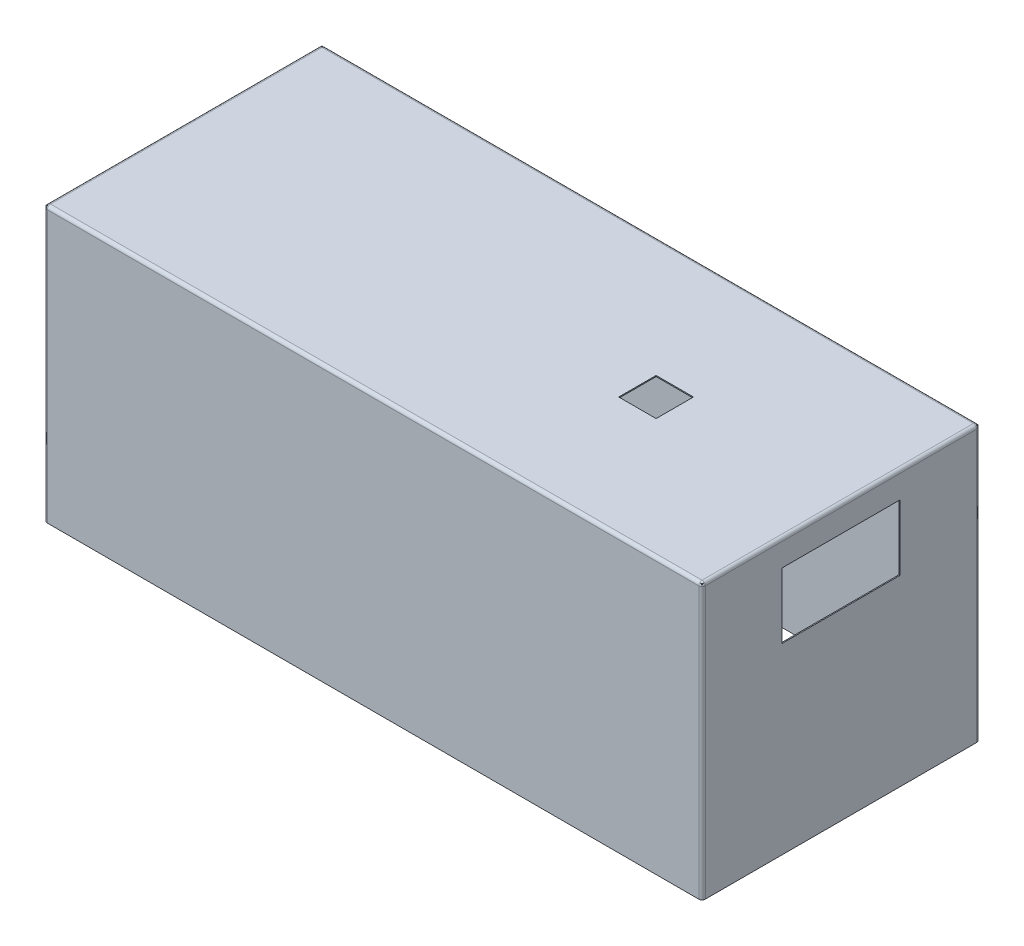
ISO-10303-21;
HEADER;
FILE_DESCRIPTION(('STEP AP214'),'2;1');
FILE_NAME('part.step','',(''),(''),'','','');
FILE_SCHEMA(('AUTOMOTIVE_DESIGN { 1 0 10303 214 1 1 1 1 }'));
ENDSEC;
DATA;
#1=APPLICATION_CONTEXT('core data for automotive mechanical design processes');
#2=APPLICATION_PROTOCOL_DEFINITION('international standard','automotive_design',2000,#1);
#3=PRODUCT_CONTEXT('',#1,'mechanical');
#4=PRODUCT('Part','Part','',(#3));
#5=PRODUCT_RELATED_PRODUCT_CATEGORY('part','',(#4));
#6=PRODUCT_DEFINITION_FORMATION('','',#4);
#7=PRODUCT_DEFINITION_CONTEXT('part definition',#1,'design');
#8=PRODUCT_DEFINITION('design','',#6,#7);
#9=PRODUCT_DEFINITION_SHAPE('','',#8);
#10=(LENGTH_UNIT() NAMED_UNIT(*) SI_UNIT(.MILLI.,.METRE.));
#11=(NAMED_UNIT(*) PLANE_ANGLE_UNIT() SI_UNIT($,.RADIAN.));
#12=(NAMED_UNIT(*) SI_UNIT($,.STERADIAN.) SOLID_ANGLE_UNIT());
#13=UNCERTAINTY_MEASURE_WITH_UNIT(LENGTH_MEASURE(1.E-05),#10,'distance_accuracy_value','');
#14=(GEOMETRIC_REPRESENTATION_CONTEXT(3) GLOBAL_UNCERTAINTY_ASSIGNED_CONTEXT((#13)) GLOBAL_UNIT_ASSIGNED_CONTEXT((#10,
#11,#12)) REPRESENTATION_CONTEXT('',''));
#15=CARTESIAN_POINT('',(0.,0.,0.));
#16=DIRECTION('',(0.,0.,1.));
#17=DIRECTION('',(1.,0.,0.));
#18=AXIS2_PLACEMENT_3D('',#15,#16,#17);
#19=CARTESIAN_POINT('',(501.5125,420.,-210.9125));
#20=DIRECTION('',(-1.,0.,0.));
#21=DIRECTION('',(0.,0.,1.));
#22=AXIS2_PLACEMENT_3D('',#19,#20,#21);
#23=PLANE('',#22);
#24=DIRECTION('',(0.,-1.,0.));
#25=VECTOR('',#24,1.);
#26=CARTESIAN_POINT('',(501.5125,420.,210.9125));
#27=LINE('',#26,#25);
#28=CARTESIAN_POINT('',(501.5125,418.4125,210.9125));
#29=VERTEX_POINT('',#28);
#30=CARTESIAN_POINT('',(501.5125,0.,210.9125));
#31=VERTEX_POINT('',#30);
#32=EDGE_CURVE('E366',#29,#31,#27,.T.);
#33=ORIENTED_EDGE('',*,*,#32,.F.);
#34=DIRECTION('',(0.,0.,-1.));
#35=VECTOR('',#34,1.);
#36=CARTESIAN_POINT('',(501.5125,418.4125,-210.9125));
#37=LINE('',#36,#35);
#38=CARTESIAN_POINT('',(501.5125,418.4125,-210.9125));
#39=VERTEX_POINT('',#38);
#40=EDGE_CURVE('E350',#29,#39,#37,.T.);
#41=ORIENTED_EDGE('',*,*,#40,.T.);
#42=DIRECTION('',(0.,-1.,0.));
#43=VECTOR('',#42,1.);
#44=CARTESIAN_POINT('',(501.5125,420.,-210.9125));
#45=LINE('',#44,#43);
#46=CARTESIAN_POINT('',(501.5125,0.,-210.9125));
#47=VERTEX_POINT('',#46);
#48=EDGE_CURVE('E373',#39,#47,#45,.T.);
#49=ORIENTED_EDGE('',*,*,#48,.T.);
#50=DIRECTION('',(0.,0.,-1.));
#51=VECTOR('',#50,1.);
#52=CARTESIAN_POINT('',(501.5125,0.,-210.9125));
#53=LINE('',#52,#51);
#54=EDGE_CURVE('E353',#31,#47,#53,.T.);
#55=ORIENTED_EDGE('',*,*,#54,.F.);
#56=EDGE_LOOP('',(#33,#41,#49,#55));
#57=FACE_BOUND('',#56,.T.);
#58=DIRECTION('',(0.,-1.,0.));
#59=VECTOR('',#58,1.);
#60=CARTESIAN_POINT('',(501.5125,420.,90.0000000000001));
#61=LINE('',#60,#59);
#62=CARTESIAN_POINT('',(501.5125,380.,90.));
#63=VERTEX_POINT('',#62);
#64=CARTESIAN_POINT('',(501.5125,280.,90.));
#65=VERTEX_POINT('',#64);
#66=EDGE_CURVE('E295',#63,#65,#61,.T.);
#67=ORIENTED_EDGE('',*,*,#66,.T.);
#68=DIRECTION('',(0.,0.,-1.));
#69=VECTOR('',#68,1.);
#70=CARTESIAN_POINT('',(501.5125,280.,-210.9125));
#71=LINE('',#70,#69);
#72=CARTESIAN_POINT('',(501.5125,280.,-90.));
#73=VERTEX_POINT('',#72);
#74=EDGE_CURVE('E298',#65,#73,#71,.T.);
#75=ORIENTED_EDGE('',*,*,#74,.T.);
#76=DIRECTION('',(0.,1.,0.));
#77=VECTOR('',#76,1.);
#78=CARTESIAN_POINT('',(501.5125,420.,-89.9999999999999));
#79=LINE('',#78,#77);
#80=CARTESIAN_POINT('',(501.5125,380.,-90.));
#81=VERTEX_POINT('',#80);
#82=EDGE_CURVE('E279',#73,#81,#79,.T.);
#83=ORIENTED_EDGE('',*,*,#82,.T.);
#84=DIRECTION('',(0.,0.,1.));
#85=VECTOR('',#84,1.);
#86=CARTESIAN_POINT('',(501.5125,380.,-210.9125));
#87=LINE('',#86,#85);
#88=EDGE_CURVE('E292',#81,#63,#87,.T.);
#89=ORIENTED_EDGE('',*,*,#88,.T.);
#90=EDGE_LOOP('',(#67,#75,#83,#89));
#91=FACE_BOUND('',#90,.T.);
#92=ADVANCED_FACE('F33',(#57,#91),#23,.T.);
#93=CARTESIAN_POINT('',(503.1,420.,-212.5));
#94=DIRECTION('',(-1.,0.,0.));
#95=DIRECTION('',(0.,0.,1.));
#96=AXIS2_PLACEMENT_3D('',#93,#94,#95);
#97=PLANE('',#96);
#98=DIRECTION('',(0.,0.,-1.));
#99=VECTOR('',#98,1.);
#100=CARTESIAN_POINT('',(503.1,415.,212.5));
#101=LINE('',#100,#99);
#102=CARTESIAN_POINT('',(503.1,415.,-207.5));
#103=VERTEX_POINT('',#102);
#104=CARTESIAN_POINT('',(503.1,415.,207.5));
#105=VERTEX_POINT('',#104);
#106=EDGE_CURVE('E420',#103,#105,#101,.F.);
#107=ORIENTED_EDGE('',*,*,#106,.T.);
#108=DIRECTION('',(0.,-1.,0.));
#109=VECTOR('',#108,1.);
#110=CARTESIAN_POINT('',(503.1,420.,207.5));
#111=LINE('',#110,#109);
#112=CARTESIAN_POINT('',(503.1,0.,207.5));
#113=VERTEX_POINT('',#112);
#114=EDGE_CURVE('E422',#105,#113,#111,.T.);
#115=ORIENTED_EDGE('',*,*,#114,.T.);
#116=DIRECTION('',(0.,0.,-1.));
#117=VECTOR('',#116,1.);
#118=CARTESIAN_POINT('',(503.1,0.,-212.5));
#119=LINE('',#118,#117);
#120=CARTESIAN_POINT('',(503.1,0.,-207.5));
#121=VERTEX_POINT('',#120);
#122=EDGE_CURVE('E375',#113,#121,#119,.T.);
#123=ORIENTED_EDGE('',*,*,#122,.T.);
#124=DIRECTION('',(0.,-1.,0.));
#125=VECTOR('',#124,1.);
#126=CARTESIAN_POINT('',(503.1,420.,-207.5));
#127=LINE('',#126,#125);
#128=EDGE_CURVE('E418',#121,#103,#127,.F.);
#129=ORIENTED_EDGE('',*,*,#128,.T.);
#130=EDGE_LOOP('',(#107,#115,#123,#129));
#131=FACE_BOUND('',#130,.T.);
#132=DIRECTION('',(0.,0.,1.));
#133=VECTOR('',#132,1.);
#134=CARTESIAN_POINT('',(503.1,280.,90.));
#135=LINE('',#134,#133);
#136=CARTESIAN_POINT('',(503.1,280.,-90.));
#137=VERTEX_POINT('',#136);
#138=CARTESIAN_POINT('',(503.1,280.,90.));
#139=VERTEX_POINT('',#138);
#140=EDGE_CURVE('E273',#137,#139,#135,.T.);
#141=ORIENTED_EDGE('',*,*,#140,.T.);
#142=DIRECTION('',(0.,1.,0.));
#143=VECTOR('',#142,1.);
#144=CARTESIAN_POINT('',(503.1,380.,90.));
#145=LINE('',#144,#143);
#146=CARTESIAN_POINT('',(503.1,380.,90.));
#147=VERTEX_POINT('',#146);
#148=EDGE_CURVE('E269',#139,#147,#145,.T.);
#149=ORIENTED_EDGE('',*,*,#148,.T.);
#150=DIRECTION('',(0.,0.,-1.));
#151=VECTOR('',#150,1.);
#152=CARTESIAN_POINT('',(503.1,380.,90.));
#153=LINE('',#152,#151);
#154=CARTESIAN_POINT('',(503.1,380.,-90.));
#155=VERTEX_POINT('',#154);
#156=EDGE_CURVE('E272',#147,#155,#153,.T.);
#157=ORIENTED_EDGE('',*,*,#156,.T.);
#158=DIRECTION('',(0.,-1.,0.));
#159=VECTOR('',#158,1.);
#160=CARTESIAN_POINT('',(503.1,380.,-90.));
#161=LINE('',#160,#159);
#162=EDGE_CURVE('E276',#155,#137,#161,.T.);
#163=ORIENTED_EDGE('',*,*,#162,.T.);
#164=EDGE_LOOP('',(#141,#149,#157,#163));
#165=FACE_BOUND('',#164,.T.);
#166=ADVANCED_FACE('F490',(#131,#165),#97,.F.);
#167=CARTESIAN_POINT('',(0.,420.,0.));
#168=DIRECTION('',(0.,1.,0.));
#169=DIRECTION('',(0.,0.,1.));
#170=AXIS2_PLACEMENT_3D('',#167,#168,#169);
#171=PLANE('',#170);
#172=DIRECTION('',(0.,0.,1.));
#173=VECTOR('',#172,1.);
#174=CARTESIAN_POINT('',(-498.1,420.,212.5));
#175=LINE('',#174,#173);
#176=CARTESIAN_POINT('',(-498.1,420.,-207.5));
#177=VERTEX_POINT('',#176);
#178=CARTESIAN_POINT('',(-498.1,420.,207.5));
#179=VERTEX_POINT('',#178);
#180=EDGE_CURVE('E394',#177,#179,#175,.T.);
#181=ORIENTED_EDGE('',*,*,#180,.T.);
#182=DIRECTION('',(1.,0.,0.));
#183=VECTOR('',#182,1.);
#184=CARTESIAN_POINT('',(503.1,420.,207.5));
#185=LINE('',#184,#183);
#186=CARTESIAN_POINT('',(498.1,420.,207.5));
#187=VERTEX_POINT('',#186);
#188=EDGE_CURVE('E396',#179,#187,#185,.T.);
#189=ORIENTED_EDGE('',*,*,#188,.T.);
#190=DIRECTION('',(0.,0.,-1.));
#191=VECTOR('',#190,1.);
#192=CARTESIAN_POINT('',(498.1,420.,-212.5));
#193=LINE('',#192,#191);
#194=CARTESIAN_POINT('',(498.1,420.,-207.5));
#195=VERTEX_POINT('',#194);
#196=EDGE_CURVE('E390',#187,#195,#193,.T.);
#197=ORIENTED_EDGE('',*,*,#196,.T.);
#198=DIRECTION('',(-1.,0.,0.));
#199=VECTOR('',#198,1.);
#200=CARTESIAN_POINT('',(-503.1,420.,-207.5));
#201=LINE('',#200,#199);
#202=EDGE_CURVE('E392',#195,#177,#201,.T.);
#203=ORIENTED_EDGE('',*,*,#202,.T.);
#204=EDGE_LOOP('',(#181,#189,#197,#203));
#205=FACE_BOUND('',#204,.T.);
#206=DIRECTION('',(-1.,0.,0.));
#207=VECTOR('',#206,1.);
#208=CARTESIAN_POINT('',(191.825,420.,-28.575));
#209=LINE('',#208,#207);
#210=CARTESIAN_POINT('',(248.975,420.,-28.575));
#211=VERTEX_POINT('',#210);
#212=CARTESIAN_POINT('',(191.825,420.,-28.575));
#213=VERTEX_POINT('',#212);
#214=EDGE_CURVE('E305',#211,#213,#209,.T.);
#215=ORIENTED_EDGE('',*,*,#214,.F.);
#216=DIRECTION('',(0.,0.,-1.));
#217=VECTOR('',#216,1.);
#218=CARTESIAN_POINT('',(248.975,420.,-28.575));
#219=LINE('',#218,#217);
#220=CARTESIAN_POINT('',(248.975,420.,28.575));
#221=VERTEX_POINT('',#220);
#222=EDGE_CURVE('E308',#221,#211,#219,.T.);
#223=ORIENTED_EDGE('',*,*,#222,.F.);
#224=DIRECTION('',(1.,0.,0.));
#225=VECTOR('',#224,1.);
#226=CARTESIAN_POINT('',(191.825,420.,28.575));
#227=LINE('',#226,#225);
#228=CARTESIAN_POINT('',(191.825,420.,28.575));
#229=VERTEX_POINT('',#228);
#230=EDGE_CURVE('E311',#229,#221,#227,.T.);
#231=ORIENTED_EDGE('',*,*,#230,.F.);
#232=DIRECTION('',(0.,0.,1.));
#233=VECTOR('',#232,1.);
#234=CARTESIAN_POINT('',(191.825,420.,-28.575));
#235=LINE('',#234,#233);
#236=EDGE_CURVE('E302',#213,#229,#235,.T.);
#237=ORIENTED_EDGE('',*,*,#236,.F.);
#238=EDGE_LOOP('',(#215,#223,#231,#237));
#239=FACE_BOUND('',#238,.T.);
#240=ADVANCED_FACE('F488',(#205,#239),#171,.T.);
#241=CARTESIAN_POINT('',(0.,418.4125,0.));
#242=DIRECTION('',(0.,1.,0.));
#243=DIRECTION('',(0.,0.,1.));
#244=AXIS2_PLACEMENT_3D('',#241,#242,#243);
#245=PLANE('',#244);
#246=ORIENTED_EDGE('',*,*,#40,.F.);
#247=DIRECTION('',(1.,0.,0.));
#248=VECTOR('',#247,1.);
#249=CARTESIAN_POINT('',(-501.5125,418.4125,210.9125));
#250=LINE('',#249,#248);
#251=CARTESIAN_POINT('',(-501.5125,418.4125,210.9125));
#252=VERTEX_POINT('',#251);
#253=EDGE_CURVE('E387',#252,#29,#250,.T.);
#254=ORIENTED_EDGE('',*,*,#253,.F.);
#255=DIRECTION('',(0.,0.,1.));
#256=VECTOR('',#255,1.);
#257=CARTESIAN_POINT('',(-501.5125,418.4125,-210.9125));
#258=LINE('',#257,#256);
#259=CARTESIAN_POINT('',(-501.5125,418.4125,-210.9125));
#260=VERTEX_POINT('',#259);
#261=EDGE_CURVE('E343',#260,#252,#258,.T.);
#262=ORIENTED_EDGE('',*,*,#261,.F.);
#263=DIRECTION('',(-1.,0.,0.));
#264=VECTOR('',#263,1.);
#265=CARTESIAN_POINT('',(-501.5125,418.4125,-210.9125));
#266=LINE('',#265,#264);
#267=EDGE_CURVE('E346',#39,#260,#266,.T.);
#268=ORIENTED_EDGE('',*,*,#267,.F.);
#269=EDGE_LOOP('',(#246,#254,#262,#268));
#270=FACE_BOUND('',#269,.T.);
#271=DIRECTION('',(0.,0.,1.));
#272=VECTOR('',#271,1.);
#273=CARTESIAN_POINT('',(248.975,418.4125,0.));
#274=LINE('',#273,#272);
#275=CARTESIAN_POINT('',(248.975,418.4125,-28.575));
#276=VERTEX_POINT('',#275);
#277=CARTESIAN_POINT('',(248.975,418.4125,28.575));
#278=VERTEX_POINT('',#277);
#279=EDGE_CURVE('E11',#276,#278,#274,.T.);
#280=ORIENTED_EDGE('',*,*,#279,.F.);
#281=DIRECTION('',(1.,0.,0.));
#282=VECTOR('',#281,1.);
#283=CARTESIAN_POINT('',(0.,418.4125,-28.575));
#284=LINE('',#283,#282);
#285=CARTESIAN_POINT('',(191.825,418.4125,-28.575));
#286=VERTEX_POINT('',#285);
#287=EDGE_CURVE('E41',#286,#276,#284,.T.);
#288=ORIENTED_EDGE('',*,*,#287,.F.);
#289=DIRECTION('',(0.,0.,-1.));
#290=VECTOR('',#289,1.);
#291=CARTESIAN_POINT('',(191.825,418.4125,0.));
#292=LINE('',#291,#290);
#293=CARTESIAN_POINT('',(191.825,418.4125,28.575));
#294=VERTEX_POINT('',#293);
#295=EDGE_CURVE('E467',#294,#286,#292,.T.);
#296=ORIENTED_EDGE('',*,*,#295,.F.);
#297=DIRECTION('',(-1.,0.,0.));
#298=VECTOR('',#297,1.);
#299=CARTESIAN_POINT('',(0.,418.4125,28.575));
#300=LINE('',#299,#298);
#301=EDGE_CURVE('E433',#278,#294,#300,.T.);
#302=ORIENTED_EDGE('',*,*,#301,.F.);
#303=EDGE_LOOP('',(#280,#288,#296,#302));
#304=FACE_BOUND('',#303,.T.);
#305=ADVANCED_FACE('F479',(#270,#304),#245,.F.);
#306=CARTESIAN_POINT('',(-501.5125,420.,-210.9125));
#307=DIRECTION('',(0.,0.,1.));
#308=DIRECTION('',(1.,0.,0.));
#309=AXIS2_PLACEMENT_3D('',#306,#307,#308);
#310=PLANE('',#309);
#311=ORIENTED_EDGE('',*,*,#48,.F.);
#312=ORIENTED_EDGE('',*,*,#267,.T.);
#313=DIRECTION('',(0.,-1.,0.));
#314=VECTOR('',#313,1.);
#315=CARTESIAN_POINT('',(-501.5125,420.,-210.9125));
#316=LINE('',#315,#314);
#317=CARTESIAN_POINT('',(-501.5125,0.,-210.9125));
#318=VERTEX_POINT('',#317);
#319=EDGE_CURVE('E371',#260,#318,#316,.T.);
#320=ORIENTED_EDGE('',*,*,#319,.T.);
#321=DIRECTION('',(-1.,0.,0.));
#322=VECTOR('',#321,1.);
#323=CARTESIAN_POINT('',(-501.5125,0.,-210.9125));
#324=LINE('',#323,#322);
#325=EDGE_CURVE('E356',#47,#318,#324,.T.);
#326=ORIENTED_EDGE('',*,*,#325,.F.);
#327=EDGE_LOOP('',(#311,#312,#320,#326));
#328=FACE_BOUND('',#327,.T.);
#329=ADVANCED_FACE('F497',(#328),#310,.T.);
#330=CARTESIAN_POINT('',(-501.5125,420.,-210.9125));
#331=DIRECTION('',(1.,0.,0.));
#332=DIRECTION('',(0.,0.,-1.));
#333=AXIS2_PLACEMENT_3D('',#330,#331,#332);
#334=PLANE('',#333);
#335=DIRECTION('',(0.,0.,-1.));
#336=VECTOR('',#335,1.);
#337=CARTESIAN_POINT('',(-501.5125,80.0000000000001,-210.9125));
#338=LINE('',#337,#336);
#339=CARTESIAN_POINT('',(-501.5125,80.,89.9999999999999));
#340=VERTEX_POINT('',#339);
#341=CARTESIAN_POINT('',(-501.5125,80.,40.));
#342=VERTEX_POINT('',#341);
#343=EDGE_CURVE('E258',#340,#342,#338,.T.);
#344=ORIENTED_EDGE('',*,*,#343,.F.);
#345=DIRECTION('',(0.,-1.,0.));
#346=VECTOR('',#345,1.);
#347=CARTESIAN_POINT('',(-501.5125,420.,89.9999999999999));
#348=LINE('',#347,#346);
#349=CARTESIAN_POINT('',(-501.5125,180.,89.9999999999999));
#350=VERTEX_POINT('',#349);
#351=EDGE_CURVE('E267',#350,#340,#348,.T.);
#352=ORIENTED_EDGE('',*,*,#351,.F.);
#353=DIRECTION('',(0.,0.,1.));
#354=VECTOR('',#353,1.);
#355=CARTESIAN_POINT('',(-501.5125,180.,-210.9125));
#356=LINE('',#355,#354);
#357=CARTESIAN_POINT('',(-501.5125,180.,-90.0000000000001));
#358=VERTEX_POINT('',#357);
#359=EDGE_CURVE('E265',#358,#350,#356,.T.);
#360=ORIENTED_EDGE('',*,*,#359,.F.);
#361=DIRECTION('',(0.,1.,0.));
#362=VECTOR('',#361,1.);
#363=CARTESIAN_POINT('',(-501.5125,420.,-90.0000000000001));
#364=LINE('',#363,#362);
#365=CARTESIAN_POINT('',(-501.5125,80.0000000000001,-90.0000000000002));
#366=VERTEX_POINT('',#365);
#367=EDGE_CURVE('E263',#366,#358,#364,.T.);
#368=ORIENTED_EDGE('',*,*,#367,.F.);
#369=CARTESIAN_POINT('',(-501.5125,80.,-40.0000000000003));
#370=VERTEX_POINT('',#369);
#371=EDGE_CURVE('E248',#370,#366,#338,.T.);
#372=ORIENTED_EDGE('',*,*,#371,.F.);
#373=DIRECTION('',(0.,-1.,0.));
#374=VECTOR('',#373,1.);
#375=CARTESIAN_POINT('',(-501.5125,0.,-40.));
#376=LINE('',#375,#374);
#377=CARTESIAN_POINT('',(-501.5125,0.,-40.0000000000003));
#378=VERTEX_POINT('',#377);
#379=EDGE_CURVE('E304',#370,#378,#376,.T.);
#380=ORIENTED_EDGE('',*,*,#379,.T.);
#381=DIRECTION('',(0.,0.,1.));
#382=VECTOR('',#381,1.);
#383=CARTESIAN_POINT('',(-501.5125,0.,-210.9125));
#384=LINE('',#383,#382);
#385=EDGE_CURVE('E360',#318,#378,#384,.T.);
#386=ORIENTED_EDGE('',*,*,#385,.F.);
#387=ORIENTED_EDGE('',*,*,#319,.F.);
#388=ORIENTED_EDGE('',*,*,#261,.T.);
#389=DIRECTION('',(0.,-1.,0.));
#390=VECTOR('',#389,1.);
#391=CARTESIAN_POINT('',(-501.5125,420.,210.9125));
#392=LINE('',#391,#390);
#393=CARTESIAN_POINT('',(-501.5125,0.,210.9125));
#394=VERTEX_POINT('',#393);
#395=EDGE_CURVE('E368',#252,#394,#392,.T.);
#396=ORIENTED_EDGE('',*,*,#395,.T.);
#397=CARTESIAN_POINT('',(-501.5125,0.,40.));
#398=VERTEX_POINT('',#397);
#399=EDGE_CURVE('E359',#398,#394,#384,.T.);
#400=ORIENTED_EDGE('',*,*,#399,.F.);
#401=DIRECTION('',(0.,1.,0.));
#402=VECTOR('',#401,1.);
#403=CARTESIAN_POINT('',(-501.5125,0.,40.));
#404=LINE('',#403,#402);
#405=EDGE_CURVE('E333',#398,#342,#404,.T.);
#406=ORIENTED_EDGE('',*,*,#405,.T.);
#407=EDGE_LOOP('',(#344,#352,#360,#368,#372,#380,#386,#387,#388,#396,#400,#406));
#408=FACE_BOUND('',#407,.T.);
#409=ADVANCED_FACE('F513',(#408),#334,.T.);
#410=CARTESIAN_POINT('',(-501.5125,420.,210.9125));
#411=DIRECTION('',(0.,0.,-1.));
#412=DIRECTION('',(-1.,0.,0.));
#413=AXIS2_PLACEMENT_3D('',#410,#411,#412);
#414=PLANE('',#413);
#415=ORIENTED_EDGE('',*,*,#395,.F.);
#416=ORIENTED_EDGE('',*,*,#253,.T.);
#417=ORIENTED_EDGE('',*,*,#32,.T.);
#418=DIRECTION('',(1.,0.,0.));
#419=VECTOR('',#418,1.);
#420=CARTESIAN_POINT('',(-501.5125,0.,210.9125));
#421=LINE('',#420,#419);
#422=EDGE_CURVE('E363',#394,#31,#421,.T.);
#423=ORIENTED_EDGE('',*,*,#422,.F.);
#424=EDGE_LOOP('',(#415,#416,#417,#423));
#425=FACE_BOUND('',#424,.T.);
#426=ADVANCED_FACE('F517',(#425),#414,.T.);
#427=CARTESIAN_POINT('',(0.,0.,0.));
#428=DIRECTION('',(0.,1.,0.));
#429=DIRECTION('',(0.,0.,1.));
#430=AXIS2_PLACEMENT_3D('',#427,#428,#429);
#431=PLANE('',#430);
#432=ORIENTED_EDGE('',*,*,#385,.T.);
#433=DIRECTION('',(-1.,0.,0.));
#434=VECTOR('',#433,1.);
#435=CARTESIAN_POINT('',(503.101,0.,-40.0000000000003));
#436=LINE('',#435,#434);
#437=CARTESIAN_POINT('',(-503.1,0.,-40.));
#438=VERTEX_POINT('',#437);
#439=EDGE_CURVE('E332',#378,#438,#436,.T.);
#440=ORIENTED_EDGE('',*,*,#439,.T.);
#441=DIRECTION('',(0.,0.,1.));
#442=VECTOR('',#441,1.);
#443=CARTESIAN_POINT('',(-503.1,0.,-212.5));
#444=LINE('',#443,#442);
#445=CARTESIAN_POINT('',(-503.1,0.,-207.5));
#446=VERTEX_POINT('',#445);
#447=EDGE_CURVE('E382',#446,#438,#444,.T.);
#448=ORIENTED_EDGE('',*,*,#447,.F.);
#449=CARTESIAN_POINT('',(-498.1,0.,-207.5));
#450=DIRECTION('',(0.,1.,0.));
#451=DIRECTION('',(0.,0.,1.));
#452=AXIS2_PLACEMENT_3D('',#449,#450,#451);
#453=CIRCLE('',#452,5.);
#454=CARTESIAN_POINT('',(-498.1,0.,-212.5));
#455=VERTEX_POINT('',#454);
#456=EDGE_CURVE('E426',#446,#455,#453,.F.);
#457=ORIENTED_EDGE('',*,*,#456,.T.);
#458=DIRECTION('',(-1.,0.,0.));
#459=VECTOR('',#458,1.);
#460=CARTESIAN_POINT('',(-503.1,0.,-212.5));
#461=LINE('',#460,#459);
#462=CARTESIAN_POINT('',(498.1,0.,-212.5));
#463=VERTEX_POINT('',#462);
#464=EDGE_CURVE('E378',#463,#455,#461,.T.);
#465=ORIENTED_EDGE('',*,*,#464,.F.);
#466=CARTESIAN_POINT('',(498.1,0.,-207.5));
#467=DIRECTION('',(0.,1.,0.));
#468=DIRECTION('',(0.,0.,1.));
#469=AXIS2_PLACEMENT_3D('',#466,#467,#468);
#470=CIRCLE('',#469,5.);
#471=EDGE_CURVE('E424',#463,#121,#470,.F.);
#472=ORIENTED_EDGE('',*,*,#471,.T.);
#473=ORIENTED_EDGE('',*,*,#122,.F.);
#474=CARTESIAN_POINT('',(498.1,0.,207.5));
#475=DIRECTION('',(0.,1.,0.));
#476=DIRECTION('',(0.,0.,1.));
#477=AXIS2_PLACEMENT_3D('',#474,#475,#476);
#478=CIRCLE('',#477,5.);
#479=CARTESIAN_POINT('',(498.1,0.,212.5));
#480=VERTEX_POINT('',#479);
#481=EDGE_CURVE('E431',#113,#480,#478,.F.);
#482=ORIENTED_EDGE('',*,*,#481,.T.);
#483=DIRECTION('',(1.,0.,0.));
#484=VECTOR('',#483,1.);
#485=CARTESIAN_POINT('',(-503.1,0.,212.5));
#486=LINE('',#485,#484);
#487=CARTESIAN_POINT('',(-498.1,0.,212.5));
#488=VERTEX_POINT('',#487);
#489=EDGE_CURVE('E384',#488,#480,#486,.T.);
#490=ORIENTED_EDGE('',*,*,#489,.F.);
#491=CARTESIAN_POINT('',(-498.1,0.,207.5));
#492=DIRECTION('',(0.,1.,0.));
#493=DIRECTION('',(0.,0.,1.));
#494=AXIS2_PLACEMENT_3D('',#491,#492,#493);
#495=CIRCLE('',#494,5.);
#496=CARTESIAN_POINT('',(-503.1,0.,207.5));
#497=VERTEX_POINT('',#496);
#498=EDGE_CURVE('E428',#488,#497,#495,.F.);
#499=ORIENTED_EDGE('',*,*,#498,.T.);
#500=CARTESIAN_POINT('',(-503.1,0.,40.));
#501=VERTEX_POINT('',#500);
#502=EDGE_CURVE('E381',#501,#497,#444,.T.);
#503=ORIENTED_EDGE('',*,*,#502,.F.);
#504=DIRECTION('',(-1.,0.,0.));
#505=VECTOR('',#504,1.);
#506=CARTESIAN_POINT('',(503.101,0.,39.9999999999997));
#507=LINE('',#506,#505);
#508=EDGE_CURVE('E329',#398,#501,#507,.T.);
#509=ORIENTED_EDGE('',*,*,#508,.F.);
#510=ORIENTED_EDGE('',*,*,#399,.T.);
#511=ORIENTED_EDGE('',*,*,#422,.T.);
#512=ORIENTED_EDGE('',*,*,#54,.T.);
#513=ORIENTED_EDGE('',*,*,#325,.T.);
#514=EDGE_LOOP('',(#432,#440,#448,#457,#465,#472,#473,#482,#490,#499,#503,#509,#510,#511,#512,#513));
#515=FACE_BOUND('',#514,.T.);
#516=ADVANCED_FACE('F520',(#515),#431,.F.);
#517=CARTESIAN_POINT('',(-503.1,420.,-212.5));
#518=DIRECTION('',(0.,0.,1.));
#519=DIRECTION('',(1.,0.,0.));
#520=AXIS2_PLACEMENT_3D('',#517,#518,#519);
#521=PLANE('',#520);
#522=ORIENTED_EDGE('',*,*,#464,.T.);
#523=DIRECTION('',(0.,-1.,0.));
#524=VECTOR('',#523,1.);
#525=CARTESIAN_POINT('',(-498.1,420.,-212.5));
#526=LINE('',#525,#524);
#527=CARTESIAN_POINT('',(-498.1,415.,-212.5));
#528=VERTEX_POINT('',#527);
#529=EDGE_CURVE('E416',#455,#528,#526,.F.);
#530=ORIENTED_EDGE('',*,*,#529,.T.);
#531=DIRECTION('',(-1.,0.,0.));
#532=VECTOR('',#531,1.);
#533=CARTESIAN_POINT('',(503.1,415.,-212.5));
#534=LINE('',#533,#532);
#535=CARTESIAN_POINT('',(498.1,415.,-212.5));
#536=VERTEX_POINT('',#535);
#537=EDGE_CURVE('E414',#528,#536,#534,.F.);
#538=ORIENTED_EDGE('',*,*,#537,.T.);
#539=DIRECTION('',(0.,-1.,0.));
#540=VECTOR('',#539,1.);
#541=CARTESIAN_POINT('',(498.1,420.,-212.5));
#542=LINE('',#541,#540);
#543=EDGE_CURVE('E412',#536,#463,#542,.T.);
#544=ORIENTED_EDGE('',*,*,#543,.T.);
#545=EDGE_LOOP('',(#522,#530,#538,#544));
#546=FACE_BOUND('',#545,.T.);
#547=ADVANCED_FACE('F619',(#546),#521,.F.);
#548=CARTESIAN_POINT('',(-503.1,420.,-212.5));
#549=DIRECTION('',(1.,0.,0.));
#550=DIRECTION('',(0.,0.,-1.));
#551=AXIS2_PLACEMENT_3D('',#548,#549,#550);
#552=PLANE('',#551);
#553=DIRECTION('',(0.,1.,0.));
#554=VECTOR('',#553,1.);
#555=CARTESIAN_POINT('',(-503.1,180.,89.9999999999999));
#556=LINE('',#555,#554);
#557=CARTESIAN_POINT('',(-503.1,80.,89.9999999999999));
#558=VERTEX_POINT('',#557);
#559=CARTESIAN_POINT('',(-503.1,180.,89.9999999999999));
#560=VERTEX_POINT('',#559);
#561=EDGE_CURVE('E260',#558,#560,#556,.T.);
#562=ORIENTED_EDGE('',*,*,#561,.F.);
#563=DIRECTION('',(0.,0.,1.));
#564=VECTOR('',#563,1.);
#565=CARTESIAN_POINT('',(-503.1,80.0000000000001,-90.0000000000002));
#566=LINE('',#565,#564);
#567=CARTESIAN_POINT('',(-503.1,80.,40.));
#568=VERTEX_POINT('',#567);
#569=EDGE_CURVE('E256',#568,#558,#566,.T.);
#570=ORIENTED_EDGE('',*,*,#569,.F.);
#571=DIRECTION('',(0.,1.,0.));
#572=VECTOR('',#571,1.);
#573=CARTESIAN_POINT('',(-503.1,0.,40.));
#574=LINE('',#573,#572);
#575=EDGE_CURVE('E324',#501,#568,#574,.T.);
#576=ORIENTED_EDGE('',*,*,#575,.F.);
#577=ORIENTED_EDGE('',*,*,#502,.T.);
#578=DIRECTION('',(0.,-1.,0.));
#579=VECTOR('',#578,1.);
#580=CARTESIAN_POINT('',(-503.1,420.,207.5));
#581=LINE('',#580,#579);
#582=CARTESIAN_POINT('',(-503.1,415.,207.5));
#583=VERTEX_POINT('',#582);
#584=EDGE_CURVE('E410',#497,#583,#581,.F.);
#585=ORIENTED_EDGE('',*,*,#584,.T.);
#586=DIRECTION('',(0.,0.,1.));
#587=VECTOR('',#586,1.);
#588=CARTESIAN_POINT('',(-503.1,415.,-212.5));
#589=LINE('',#588,#587);
#590=CARTESIAN_POINT('',(-503.1,415.,-207.5));
#591=VERTEX_POINT('',#590);
#592=EDGE_CURVE('E408',#583,#591,#589,.F.);
#593=ORIENTED_EDGE('',*,*,#592,.T.);
#594=DIRECTION('',(0.,-1.,0.));
#595=VECTOR('',#594,1.);
#596=CARTESIAN_POINT('',(-503.1,420.,-207.5));
#597=LINE('',#596,#595);
#598=EDGE_CURVE('E406',#591,#446,#597,.T.);
#599=ORIENTED_EDGE('',*,*,#598,.T.);
#600=ORIENTED_EDGE('',*,*,#447,.T.);
#601=DIRECTION('',(0.,-1.,0.));
#602=VECTOR('',#601,1.);
#603=CARTESIAN_POINT('',(-503.1,0.,-40.));
#604=LINE('',#603,#602);
#605=CARTESIAN_POINT('',(-503.1,80.,-40.));
#606=VERTEX_POINT('',#605);
#607=EDGE_CURVE('E255',#606,#438,#604,.T.);
#608=ORIENTED_EDGE('',*,*,#607,.F.);
#609=CARTESIAN_POINT('',(-503.1,80.0000000000001,-90.0000000000002));
#610=VERTEX_POINT('',#609);
#611=EDGE_CURVE('E245',#610,#606,#566,.T.);
#612=ORIENTED_EDGE('',*,*,#611,.F.);
#613=DIRECTION('',(0.,-1.,0.));
#614=VECTOR('',#613,1.);
#615=CARTESIAN_POINT('',(-503.1,180.,-90.0000000000001));
#616=LINE('',#615,#614);
#617=CARTESIAN_POINT('',(-503.1,180.,-90.0000000000001));
#618=VERTEX_POINT('',#617);
#619=EDGE_CURVE('E230',#618,#610,#616,.T.);
#620=ORIENTED_EDGE('',*,*,#619,.F.);
#621=DIRECTION('',(0.,0.,-1.));
#622=VECTOR('',#621,1.);
#623=CARTESIAN_POINT('',(-503.1,180.,-90.0000000000001));
#624=LINE('',#623,#622);
#625=EDGE_CURVE('E240',#560,#618,#624,.T.);
#626=ORIENTED_EDGE('',*,*,#625,.F.);
#627=EDGE_LOOP('',(#562,#570,#576,#577,#585,#593,#599,#600,#608,#612,#620,#626));
#628=FACE_BOUND('',#627,.T.);
#629=ADVANCED_FACE('F253',(#628),#552,.F.);
#630=CARTESIAN_POINT('',(-503.1,420.,212.5));
#631=DIRECTION('',(0.,0.,-1.));
#632=DIRECTION('',(-1.,0.,0.));
#633=AXIS2_PLACEMENT_3D('',#630,#631,#632);
#634=PLANE('',#633);
#635=ORIENTED_EDGE('',*,*,#489,.T.);
#636=DIRECTION('',(0.,-1.,0.));
#637=VECTOR('',#636,1.);
#638=CARTESIAN_POINT('',(498.1,420.,212.5));
#639=LINE('',#638,#637);
#640=CARTESIAN_POINT('',(498.1,415.,212.5));
#641=VERTEX_POINT('',#640);
#642=EDGE_CURVE('E404',#480,#641,#639,.F.);
#643=ORIENTED_EDGE('',*,*,#642,.T.);
#644=DIRECTION('',(1.,0.,0.));
#645=VECTOR('',#644,1.);
#646=CARTESIAN_POINT('',(-503.1,415.,212.5));
#647=LINE('',#646,#645);
#648=CARTESIAN_POINT('',(-498.1,415.,212.5));
#649=VERTEX_POINT('',#648);
#650=EDGE_CURVE('E401',#641,#649,#647,.F.);
#651=ORIENTED_EDGE('',*,*,#650,.T.);
#652=DIRECTION('',(0.,-1.,0.));
#653=VECTOR('',#652,1.);
#654=CARTESIAN_POINT('',(-498.1,420.,212.5));
#655=LINE('',#654,#653);
#656=EDGE_CURVE('E399',#649,#488,#655,.T.);
#657=ORIENTED_EDGE('',*,*,#656,.T.);
#658=EDGE_LOOP('',(#635,#643,#651,#657));
#659=FACE_BOUND('',#658,.T.);
#660=ADVANCED_FACE('F648',(#659),#634,.F.);
#661=CARTESIAN_POINT('',(-498.1,420.,-207.5));
#662=DIRECTION('',(0.,-1.,0.));
#663=DIRECTION('',(0.,0.,-1.));
#664=AXIS2_PLACEMENT_3D('',#661,#662,#663);
#665=CYLINDRICAL_SURFACE('',#664,5.);
#666=ORIENTED_EDGE('',*,*,#456,.F.);
#667=ORIENTED_EDGE('',*,*,#598,.F.);
#668=CARTESIAN_POINT('',(-498.1,415.,-207.5));
#669=DIRECTION('',(0.,1.,0.));
#670=DIRECTION('',(0.,0.,1.));
#671=AXIS2_PLACEMENT_3D('',#668,#669,#670);
#672=CIRCLE('',#671,5.);
#673=EDGE_CURVE('E347',#528,#591,#672,.T.);
#674=ORIENTED_EDGE('',*,*,#673,.F.);
#675=ORIENTED_EDGE('',*,*,#529,.F.);
#676=EDGE_LOOP('',(#666,#667,#674,#675));
#677=FACE_BOUND('',#676,.T.);
#678=ADVANCED_FACE('F35',(#677),#665,.T.);
#679=CARTESIAN_POINT('',(0.,415.,-207.5));
#680=DIRECTION('',(1.,0.,0.));
#681=DIRECTION('',(0.,0.,-1.));
#682=AXIS2_PLACEMENT_3D('',#679,#680,#681);
#683=CYLINDRICAL_SURFACE('',#682,5.);
#684=CARTESIAN_POINT('',(498.1,415.,-207.5));
#685=DIRECTION('',(1.,0.,0.));
#686=DIRECTION('',(0.,1.,0.));
#687=AXIS2_PLACEMENT_3D('',#684,#685,#686);
#688=CIRCLE('',#687,5.);
#689=EDGE_CURVE('E458',#536,#195,#688,.T.);
#690=ORIENTED_EDGE('',*,*,#689,.F.);
#691=ORIENTED_EDGE('',*,*,#537,.F.);
#692=CARTESIAN_POINT('',(-498.1,415.,-207.5));
#693=DIRECTION('',(-1.,0.,0.));
#694=DIRECTION('',(0.,0.,1.));
#695=AXIS2_PLACEMENT_3D('',#692,#693,#694);
#696=CIRCLE('',#695,5.);
#697=EDGE_CURVE('E461',#177,#528,#696,.T.);
#698=ORIENTED_EDGE('',*,*,#697,.F.);
#699=ORIENTED_EDGE('',*,*,#202,.F.);
#700=EDGE_LOOP('',(#690,#691,#698,#699));
#701=FACE_BOUND('',#700,.T.);
#702=ADVANCED_FACE('F630',(#701),#683,.T.);
#703=CARTESIAN_POINT('',(498.1,420.,-207.5));
#704=DIRECTION('',(0.,-1.,0.));
#705=DIRECTION('',(0.,0.,-1.));
#706=AXIS2_PLACEMENT_3D('',#703,#704,#705);
#707=CYLINDRICAL_SURFACE('',#706,5.);
#708=ORIENTED_EDGE('',*,*,#471,.F.);
#709=ORIENTED_EDGE('',*,*,#543,.F.);
#710=CARTESIAN_POINT('',(498.1,415.,-207.5));
#711=DIRECTION('',(0.,1.,0.));
#712=DIRECTION('',(0.,0.,1.));
#713=AXIS2_PLACEMENT_3D('',#710,#711,#712);
#714=CIRCLE('',#713,5.);
#715=EDGE_CURVE('E455',#103,#536,#714,.T.);
#716=ORIENTED_EDGE('',*,*,#715,.F.);
#717=ORIENTED_EDGE('',*,*,#128,.F.);
#718=EDGE_LOOP('',(#708,#709,#716,#717));
#719=FACE_BOUND('',#718,.T.);
#720=ADVANCED_FACE('F625',(#719),#707,.T.);
#721=CARTESIAN_POINT('',(-498.1,415.,-207.5));
#722=DIRECTION('',(0.,0.,-1.));
#723=DIRECTION('',(-1.,0.,0.));
#724=AXIS2_PLACEMENT_3D('',#721,#722,#723);
#725=SPHERICAL_SURFACE('',#724,5.);
#726=ORIENTED_EDGE('',*,*,#697,.T.);
#727=ORIENTED_EDGE('',*,*,#673,.T.);
#728=CARTESIAN_POINT('',(-498.1,415.,-207.5));
#729=DIRECTION('',(0.,0.,-1.));
#730=DIRECTION('',(-1.,0.,0.));
#731=AXIS2_PLACEMENT_3D('',#728,#729,#730);
#732=CIRCLE('',#731,5.);
#733=EDGE_CURVE('E452',#177,#591,#732,.F.);
#734=ORIENTED_EDGE('',*,*,#733,.F.);
#735=EDGE_LOOP('',(#726,#727,#734));
#736=FACE_BOUND('',#735,.T.);
#737=ADVANCED_FACE('F601',(#736),#725,.T.);
#738=CARTESIAN_POINT('',(498.1,415.,-207.5));
#739=DIRECTION('',(0.,0.,-1.));
#740=DIRECTION('',(-1.,0.,0.));
#741=AXIS2_PLACEMENT_3D('',#738,#739,#740);
#742=SPHERICAL_SURFACE('',#741,5.);
#743=ORIENTED_EDGE('',*,*,#715,.T.);
#744=ORIENTED_EDGE('',*,*,#689,.T.);
#745=CARTESIAN_POINT('',(498.1,415.,-207.5));
#746=DIRECTION('',(0.,0.,-1.));
#747=DIRECTION('',(-1.,0.,0.));
#748=AXIS2_PLACEMENT_3D('',#745,#746,#747);
#749=CIRCLE('',#748,5.);
#750=EDGE_CURVE('E449',#103,#195,#749,.F.);
#751=ORIENTED_EDGE('',*,*,#750,.F.);
#752=EDGE_LOOP('',(#743,#744,#751));
#753=FACE_BOUND('',#752,.T.);
#754=ADVANCED_FACE('F632',(#753),#742,.T.);
#755=CARTESIAN_POINT('',(-498.1,420.,207.5));
#756=DIRECTION('',(0.,-1.,0.));
#757=DIRECTION('',(0.,0.,-1.));
#758=AXIS2_PLACEMENT_3D('',#755,#756,#757);
#759=CYLINDRICAL_SURFACE('',#758,5.);
#760=ORIENTED_EDGE('',*,*,#498,.F.);
#761=ORIENTED_EDGE('',*,*,#656,.F.);
#762=CARTESIAN_POINT('',(-498.1,415.,207.5));
#763=DIRECTION('',(0.,1.,0.));
#764=DIRECTION('',(0.,0.,1.));
#765=AXIS2_PLACEMENT_3D('',#762,#763,#764);
#766=CIRCLE('',#765,5.);
#767=EDGE_CURVE('E446',#583,#649,#766,.T.);
#768=ORIENTED_EDGE('',*,*,#767,.F.);
#769=ORIENTED_EDGE('',*,*,#584,.F.);
#770=EDGE_LOOP('',(#760,#761,#768,#769));
#771=FACE_BOUND('',#770,.T.);
#772=ADVANCED_FACE('F591',(#771),#759,.T.);
#773=CARTESIAN_POINT('',(-498.1,415.,0.));
#774=DIRECTION('',(0.,0.,-1.));
#775=DIRECTION('',(-1.,0.,0.));
#776=AXIS2_PLACEMENT_3D('',#773,#774,#775);
#777=CYLINDRICAL_SURFACE('',#776,5.);
#778=ORIENTED_EDGE('',*,*,#733,.T.);
#779=ORIENTED_EDGE('',*,*,#592,.F.);
#780=CARTESIAN_POINT('',(-498.1,415.,207.5));
#781=DIRECTION('',(0.,0.,1.));
#782=DIRECTION('',(1.,0.,0.));
#783=AXIS2_PLACEMENT_3D('',#780,#781,#782);
#784=CIRCLE('',#783,5.);
#785=EDGE_CURVE('E443',#179,#583,#784,.T.);
#786=ORIENTED_EDGE('',*,*,#785,.F.);
#787=ORIENTED_EDGE('',*,*,#180,.F.);
#788=EDGE_LOOP('',(#778,#779,#786,#787));
#789=FACE_BOUND('',#788,.T.);
#790=ADVANCED_FACE('F596',(#789),#777,.T.);
#791=CARTESIAN_POINT('',(498.1,415.,0.));
#792=DIRECTION('',(0.,0.,1.));
#793=DIRECTION('',(1.,0.,0.));
#794=AXIS2_PLACEMENT_3D('',#791,#792,#793);
#795=CYLINDRICAL_SURFACE('',#794,5.);
#796=ORIENTED_EDGE('',*,*,#750,.T.);
#797=ORIENTED_EDGE('',*,*,#196,.F.);
#798=CARTESIAN_POINT('',(498.1,415.,207.5));
#799=DIRECTION('',(0.,0.,1.));
#800=DIRECTION('',(1.,0.,0.));
#801=AXIS2_PLACEMENT_3D('',#798,#799,#800);
#802=CIRCLE('',#801,5.);
#803=EDGE_CURVE('E440',#105,#187,#802,.T.);
#804=ORIENTED_EDGE('',*,*,#803,.F.);
#805=ORIENTED_EDGE('',*,*,#106,.F.);
#806=EDGE_LOOP('',(#796,#797,#804,#805));
#807=FACE_BOUND('',#806,.T.);
#808=ADVANCED_FACE('F637',(#807),#795,.T.);
#809=CARTESIAN_POINT('',(498.1,420.,207.5));
#810=DIRECTION('',(0.,-1.,0.));
#811=DIRECTION('',(0.,0.,-1.));
#812=AXIS2_PLACEMENT_3D('',#809,#810,#811);
#813=CYLINDRICAL_SURFACE('',#812,5.);
#814=ORIENTED_EDGE('',*,*,#481,.F.);
#815=ORIENTED_EDGE('',*,*,#114,.F.);
#816=CARTESIAN_POINT('',(498.1,415.,207.5));
#817=DIRECTION('',(0.,1.,0.));
#818=DIRECTION('',(0.,0.,1.));
#819=AXIS2_PLACEMENT_3D('',#816,#817,#818);
#820=CIRCLE('',#819,5.);
#821=EDGE_CURVE('E437',#641,#105,#820,.T.);
#822=ORIENTED_EDGE('',*,*,#821,.F.);
#823=ORIENTED_EDGE('',*,*,#642,.F.);
#824=EDGE_LOOP('',(#814,#815,#822,#823));
#825=FACE_BOUND('',#824,.T.);
#826=ADVANCED_FACE('F644',(#825),#813,.T.);
#827=CARTESIAN_POINT('',(-498.1,415.,207.5));
#828=DIRECTION('',(-1.,0.,0.));
#829=DIRECTION('',(0.,0.,1.));
#830=AXIS2_PLACEMENT_3D('',#827,#828,#829);
#831=SPHERICAL_SURFACE('',#830,5.);
#832=ORIENTED_EDGE('',*,*,#785,.T.);
#833=ORIENTED_EDGE('',*,*,#767,.T.);
#834=CARTESIAN_POINT('',(-498.1,415.,207.5));
#835=DIRECTION('',(-1.,0.,0.));
#836=DIRECTION('',(0.,0.,1.));
#837=AXIS2_PLACEMENT_3D('',#834,#835,#836);
#838=CIRCLE('',#837,5.);
#839=EDGE_CURVE('E435',#179,#649,#838,.F.);
#840=ORIENTED_EDGE('',*,*,#839,.F.);
#841=EDGE_LOOP('',(#832,#833,#840));
#842=FACE_BOUND('',#841,.T.);
#843=ADVANCED_FACE('F655',(#842),#831,.T.);
#844=CARTESIAN_POINT('',(498.1,415.,207.5));
#845=DIRECTION('',(1.,0.,0.));
#846=DIRECTION('',(0.,0.,-1.));
#847=AXIS2_PLACEMENT_3D('',#844,#845,#846);
#848=SPHERICAL_SURFACE('',#847,5.);
#849=ORIENTED_EDGE('',*,*,#821,.T.);
#850=ORIENTED_EDGE('',*,*,#803,.T.);
#851=CARTESIAN_POINT('',(498.1,415.,207.5));
#852=DIRECTION('',(1.,0.,0.));
#853=DIRECTION('',(0.,0.,-1.));
#854=AXIS2_PLACEMENT_3D('',#851,#852,#853);
#855=CIRCLE('',#854,5.);
#856=EDGE_CURVE('E327',#641,#187,#855,.F.);
#857=ORIENTED_EDGE('',*,*,#856,.F.);
#858=EDGE_LOOP('',(#849,#850,#857));
#859=FACE_BOUND('',#858,.T.);
#860=ADVANCED_FACE('F653',(#859),#848,.T.);
#861=CARTESIAN_POINT('',(0.,415.,207.5));
#862=DIRECTION('',(-1.,0.,0.));
#863=DIRECTION('',(0.,0.,1.));
#864=AXIS2_PLACEMENT_3D('',#861,#862,#863);
#865=CYLINDRICAL_SURFACE('',#864,5.);
#866=ORIENTED_EDGE('',*,*,#839,.T.);
#867=ORIENTED_EDGE('',*,*,#650,.F.);
#868=ORIENTED_EDGE('',*,*,#856,.T.);
#869=ORIENTED_EDGE('',*,*,#188,.F.);
#870=EDGE_LOOP('',(#866,#867,#868,#869));
#871=FACE_BOUND('',#870,.T.);
#872=ADVANCED_FACE('F527',(#871),#865,.T.);
#873=CARTESIAN_POINT('',(503.101,0.,-40.0000000000003));
#874=DIRECTION('',(0.,0.,-1.));
#875=DIRECTION('',(-1.,0.,0.));
#876=AXIS2_PLACEMENT_3D('',#873,#874,#875);
#877=PLANE('',#876);
#878=DIRECTION('',(-1.,0.,0.));
#879=VECTOR('',#878,1.);
#880=CARTESIAN_POINT('',(503.101,80.,-40.0000000000003));
#881=LINE('',#880,#879);
#882=EDGE_CURVE('E337',#370,#606,#881,.T.);
#883=ORIENTED_EDGE('',*,*,#882,.T.);
#884=ORIENTED_EDGE('',*,*,#607,.T.);
#885=ORIENTED_EDGE('',*,*,#439,.F.);
#886=ORIENTED_EDGE('',*,*,#379,.F.);
#887=EDGE_LOOP('',(#883,#884,#885,#886));
#888=FACE_BOUND('',#887,.T.);
#889=ADVANCED_FACE('F523',(#888),#877,.F.);
#890=CARTESIAN_POINT('',(503.101,0.,39.9999999999997));
#891=DIRECTION('',(0.,0.,1.));
#892=DIRECTION('',(1.,0.,0.));
#893=AXIS2_PLACEMENT_3D('',#890,#891,#892);
#894=PLANE('',#893);
#895=ORIENTED_EDGE('',*,*,#508,.T.);
#896=ORIENTED_EDGE('',*,*,#575,.T.);
#897=DIRECTION('',(-1.,0.,0.));
#898=VECTOR('',#897,1.);
#899=CARTESIAN_POINT('',(503.101,80.,39.9999999999997));
#900=LINE('',#899,#898);
#901=EDGE_CURVE('E336',#342,#568,#900,.T.);
#902=ORIENTED_EDGE('',*,*,#901,.F.);
#903=ORIENTED_EDGE('',*,*,#405,.F.);
#904=EDGE_LOOP('',(#895,#896,#902,#903));
#905=FACE_BOUND('',#904,.T.);
#906=ADVANCED_FACE('F526',(#905),#894,.F.);
#907=CARTESIAN_POINT('',(248.975,500.822305089622,-28.575));
#908=DIRECTION('',(-1.,0.,0.));
#909=DIRECTION('',(0.,0.,1.));
#910=AXIS2_PLACEMENT_3D('',#907,#908,#909);
#911=PLANE('',#910);
#912=ORIENTED_EDGE('',*,*,#279,.T.);
#913=DIRECTION('',(0.,-1.,0.));
#914=VECTOR('',#913,1.);
#915=CARTESIAN_POINT('',(248.975,500.822305089622,28.575));
#916=LINE('',#915,#914);
#917=EDGE_CURVE('E301',#221,#278,#916,.T.);
#918=ORIENTED_EDGE('',*,*,#917,.F.);
#919=ORIENTED_EDGE('',*,*,#222,.T.);
#920=DIRECTION('',(0.,-1.,0.));
#921=VECTOR('',#920,1.);
#922=CARTESIAN_POINT('',(248.975,500.822305089622,-28.575));
#923=LINE('',#922,#921);
#924=EDGE_CURVE('E315',#211,#276,#923,.T.);
#925=ORIENTED_EDGE('',*,*,#924,.T.);
#926=EDGE_LOOP('',(#912,#918,#919,#925));
#927=FACE_BOUND('',#926,.T.);
#928=ADVANCED_FACE('F475',(#927),#911,.T.);
#929=CARTESIAN_POINT('',(191.825,500.822305089622,-28.575));
#930=DIRECTION('',(0.,0.,1.));
#931=DIRECTION('',(1.,0.,0.));
#932=AXIS2_PLACEMENT_3D('',#929,#930,#931);
#933=PLANE('',#932);
#934=ORIENTED_EDGE('',*,*,#287,.T.);
#935=ORIENTED_EDGE('',*,*,#924,.F.);
#936=ORIENTED_EDGE('',*,*,#214,.T.);
#937=DIRECTION('',(0.,-1.,0.));
#938=VECTOR('',#937,1.);
#939=CARTESIAN_POINT('',(191.825,500.822305089622,-28.575));
#940=LINE('',#939,#938);
#941=EDGE_CURVE('E318',#213,#286,#940,.T.);
#942=ORIENTED_EDGE('',*,*,#941,.T.);
#943=EDGE_LOOP('',(#934,#935,#936,#942));
#944=FACE_BOUND('',#943,.T.);
#945=ADVANCED_FACE('F470',(#944),#933,.T.);
#946=CARTESIAN_POINT('',(191.825,500.822305089622,-28.575));
#947=DIRECTION('',(1.,0.,0.));
#948=DIRECTION('',(0.,0.,-1.));
#949=AXIS2_PLACEMENT_3D('',#946,#947,#948);
#950=PLANE('',#949);
#951=ORIENTED_EDGE('',*,*,#295,.T.);
#952=ORIENTED_EDGE('',*,*,#941,.F.);
#953=ORIENTED_EDGE('',*,*,#236,.T.);
#954=DIRECTION('',(0.,-1.,0.));
#955=VECTOR('',#954,1.);
#956=CARTESIAN_POINT('',(191.825,500.822305089622,28.575));
#957=LINE('',#956,#955);
#958=EDGE_CURVE('E314',#229,#294,#957,.T.);
#959=ORIENTED_EDGE('',*,*,#958,.T.);
#960=EDGE_LOOP('',(#951,#952,#953,#959));
#961=FACE_BOUND('',#960,.T.);
#962=ADVANCED_FACE('F485',(#961),#950,.T.);
#963=CARTESIAN_POINT('',(191.825,500.822305089622,28.575));
#964=DIRECTION('',(0.,0.,-1.));
#965=DIRECTION('',(-1.,0.,0.));
#966=AXIS2_PLACEMENT_3D('',#963,#964,#965);
#967=PLANE('',#966);
#968=ORIENTED_EDGE('',*,*,#301,.T.);
#969=ORIENTED_EDGE('',*,*,#958,.F.);
#970=ORIENTED_EDGE('',*,*,#230,.T.);
#971=ORIENTED_EDGE('',*,*,#917,.T.);
#972=EDGE_LOOP('',(#968,#969,#970,#971));
#973=FACE_BOUND('',#972,.T.);
#974=ADVANCED_FACE('F482',(#973),#967,.T.);
#975=CARTESIAN_POINT('',(709.01260281974,280.,90.));
#976=DIRECTION('',(0.,1.,0.));
#977=DIRECTION('',(0.,0.,1.));
#978=AXIS2_PLACEMENT_3D('',#975,#976,#977);
#979=PLANE('',#978);
#980=DIRECTION('',(-1.,0.,0.));
#981=VECTOR('',#980,1.);
#982=CARTESIAN_POINT('',(709.01260281974,280.,90.));
#983=LINE('',#982,#981);
#984=EDGE_CURVE('E281',#139,#65,#983,.T.);
#985=ORIENTED_EDGE('',*,*,#984,.F.);
#986=ORIENTED_EDGE('',*,*,#140,.F.);
#987=DIRECTION('',(-1.,0.,0.));
#988=VECTOR('',#987,1.);
#989=CARTESIAN_POINT('',(709.01260281974,280.,-90.));
#990=LINE('',#989,#988);
#991=EDGE_CURVE('E53',#137,#73,#990,.T.);
#992=ORIENTED_EDGE('',*,*,#991,.T.);
#993=ORIENTED_EDGE('',*,*,#74,.F.);
#994=EDGE_LOOP('',(#985,#986,#992,#993));
#995=FACE_BOUND('',#994,.T.);
#996=ADVANCED_FACE('F540',(#995),#979,.T.);
#997=CARTESIAN_POINT('',(709.01260281974,380.,90.));
#998=DIRECTION('',(0.,0.,-1.));
#999=DIRECTION('',(0.,1.,0.));
#1000=AXIS2_PLACEMENT_3D('',#997,#998,#999);
#1001=PLANE('',#1000);
#1002=DIRECTION('',(-1.,0.,0.));
#1003=VECTOR('',#1002,1.);
#1004=CARTESIAN_POINT('',(709.01260281974,380.,90.));
#1005=LINE('',#1004,#1003);
#1006=EDGE_CURVE('E284',#147,#63,#1005,.T.);
#1007=ORIENTED_EDGE('',*,*,#1006,.F.);
#1008=ORIENTED_EDGE('',*,*,#148,.F.);
#1009=ORIENTED_EDGE('',*,*,#984,.T.);
#1010=ORIENTED_EDGE('',*,*,#66,.F.);
#1011=EDGE_LOOP('',(#1007,#1008,#1009,#1010));
#1012=FACE_BOUND('',#1011,.T.);
#1013=ADVANCED_FACE('F548',(#1012),#1001,.T.);
#1014=CARTESIAN_POINT('',(709.01260281974,380.,90.));
#1015=DIRECTION('',(0.,-1.,0.));
#1016=DIRECTION('',(0.,0.,-1.));
#1017=AXIS2_PLACEMENT_3D('',#1014,#1015,#1016);
#1018=PLANE('',#1017);
#1019=DIRECTION('',(-1.,0.,0.));
#1020=VECTOR('',#1019,1.);
#1021=CARTESIAN_POINT('',(709.01260281974,380.,-90.));
#1022=LINE('',#1021,#1020);
#1023=EDGE_CURVE('E48',#155,#81,#1022,.T.);
#1024=ORIENTED_EDGE('',*,*,#1023,.F.);
#1025=ORIENTED_EDGE('',*,*,#156,.F.);
#1026=ORIENTED_EDGE('',*,*,#1006,.T.);
#1027=ORIENTED_EDGE('',*,*,#88,.F.);
#1028=EDGE_LOOP('',(#1024,#1025,#1026,#1027));
#1029=FACE_BOUND('',#1028,.T.);
#1030=ADVANCED_FACE('F545',(#1029),#1018,.T.);
#1031=CARTESIAN_POINT('',(709.01260281974,380.,-90.));
#1032=DIRECTION('',(0.,0.,1.));
#1033=DIRECTION('',(0.,-1.,0.));
#1034=AXIS2_PLACEMENT_3D('',#1031,#1032,#1033);
#1035=PLANE('',#1034);
#1036=ORIENTED_EDGE('',*,*,#991,.F.);
#1037=ORIENTED_EDGE('',*,*,#162,.F.);
#1038=ORIENTED_EDGE('',*,*,#1023,.T.);
#1039=ORIENTED_EDGE('',*,*,#82,.F.);
#1040=EDGE_LOOP('',(#1036,#1037,#1038,#1039));
#1041=FACE_BOUND('',#1040,.T.);
#1042=ADVANCED_FACE('F541',(#1041),#1035,.T.);
#1043=CARTESIAN_POINT('',(-709.01260281974,80.0000000000001,-90.0000000000002));
#1044=DIRECTION('',(0.,-1.,0.));
#1045=DIRECTION('',(0.,0.,-1.));
#1046=AXIS2_PLACEMENT_3D('',#1043,#1044,#1045);
#1047=PLANE('',#1046);
#1048=ORIENTED_EDGE('',*,*,#343,.T.);
#1049=ORIENTED_EDGE('',*,*,#901,.T.);
#1050=ORIENTED_EDGE('',*,*,#569,.T.);
#1051=DIRECTION('',(1.,0.,0.));
#1052=VECTOR('',#1051,1.);
#1053=CARTESIAN_POINT('',(-709.01260281974,80.,89.9999999999999));
#1054=LINE('',#1053,#1052);
#1055=EDGE_CURVE('E249',#558,#340,#1054,.T.);
#1056=ORIENTED_EDGE('',*,*,#1055,.T.);
#1057=EDGE_LOOP('',(#1048,#1049,#1050,#1056));
#1058=FACE_BOUND('',#1057,.T.);
#1059=ADVANCED_FACE('F544',(#1058),#1047,.F.);
#1060=ORIENTED_EDGE('',*,*,#371,.T.);
#1061=DIRECTION('',(1.,0.,0.));
#1062=VECTOR('',#1061,1.);
#1063=CARTESIAN_POINT('',(-709.01260281974,80.0000000000001,-90.0000000000002));
#1064=LINE('',#1063,#1062);
#1065=EDGE_CURVE('E233',#610,#366,#1064,.T.);
#1066=ORIENTED_EDGE('',*,*,#1065,.F.);
#1067=ORIENTED_EDGE('',*,*,#611,.T.);
#1068=ORIENTED_EDGE('',*,*,#882,.F.);
#1069=EDGE_LOOP('',(#1060,#1066,#1067,#1068));
#1070=FACE_BOUND('',#1069,.T.);
#1071=ADVANCED_FACE('F244',(#1070),#1047,.F.);
#1072=CARTESIAN_POINT('',(-709.01260281974,180.,89.9999999999999));
#1073=DIRECTION('',(0.,0.,1.));
#1074=DIRECTION('',(0.,-1.,0.));
#1075=AXIS2_PLACEMENT_3D('',#1072,#1073,#1074);
#1076=PLANE('',#1075);
#1077=ORIENTED_EDGE('',*,*,#351,.T.);
#1078=ORIENTED_EDGE('',*,*,#1055,.F.);
#1079=ORIENTED_EDGE('',*,*,#561,.T.);
#1080=DIRECTION('',(1.,0.,0.));
#1081=VECTOR('',#1080,1.);
#1082=CARTESIAN_POINT('',(-709.01260281974,180.,89.9999999999999));
#1083=LINE('',#1082,#1081);
#1084=EDGE_CURVE('E241',#560,#350,#1083,.T.);
#1085=ORIENTED_EDGE('',*,*,#1084,.T.);
#1086=EDGE_LOOP('',(#1077,#1078,#1079,#1085));
#1087=FACE_BOUND('',#1086,.T.);
#1088=ADVANCED_FACE('F556',(#1087),#1076,.F.);
#1089=CARTESIAN_POINT('',(-709.01260281974,180.,-90.0000000000001));
#1090=DIRECTION('',(0.,1.,0.));
#1091=DIRECTION('',(0.,0.,1.));
#1092=AXIS2_PLACEMENT_3D('',#1089,#1090,#1091);
#1093=PLANE('',#1092);
#1094=ORIENTED_EDGE('',*,*,#359,.T.);
#1095=ORIENTED_EDGE('',*,*,#1084,.F.);
#1096=ORIENTED_EDGE('',*,*,#625,.T.);
#1097=DIRECTION('',(1.,0.,0.));
#1098=VECTOR('',#1097,1.);
#1099=CARTESIAN_POINT('',(-709.01260281974,180.,-90.0000000000001));
#1100=LINE('',#1099,#1098);
#1101=EDGE_CURVE('E236',#618,#358,#1100,.T.);
#1102=ORIENTED_EDGE('',*,*,#1101,.T.);
#1103=EDGE_LOOP('',(#1094,#1095,#1096,#1102));
#1104=FACE_BOUND('',#1103,.T.);
#1105=ADVANCED_FACE('F559',(#1104),#1093,.F.);
#1106=CARTESIAN_POINT('',(-709.01260281974,180.,-90.0000000000001));
#1107=DIRECTION('',(0.,0.,-1.));
#1108=DIRECTION('',(0.,1.,0.));
#1109=AXIS2_PLACEMENT_3D('',#1106,#1107,#1108);
#1110=PLANE('',#1109);
#1111=ORIENTED_EDGE('',*,*,#367,.T.);
#1112=ORIENTED_EDGE('',*,*,#1101,.F.);
#1113=ORIENTED_EDGE('',*,*,#619,.T.);
#1114=ORIENTED_EDGE('',*,*,#1065,.T.);
#1115=EDGE_LOOP('',(#1111,#1112,#1113,#1114));
#1116=FACE_BOUND('',#1115,.T.);
#1117=ADVANCED_FACE('F232',(#1116),#1110,.F.);
#1118=CLOSED_SHELL('',(#92,#166,#240,#305,#329,#409,#426,#516,#547,#629,#660,#678,#702,#720,
#737,#754,#772,#790,#808,#826,#843,#860,#872,#889,#906,#928,#945,#962,#974,#996,#1013,#1030,
#1042,#1059,#1071,#1088,#1105,#1117));
#1119=MANIFOLD_SOLID_BREP('B2',#1118);
#1120=ADVANCED_BREP_SHAPE_REPRESENTATION('',(#18,#1119),#14);
#1121=SHAPE_DEFINITION_REPRESENTATION(#9,#1120);
ENDSEC;
END-ISO-10303-21;
